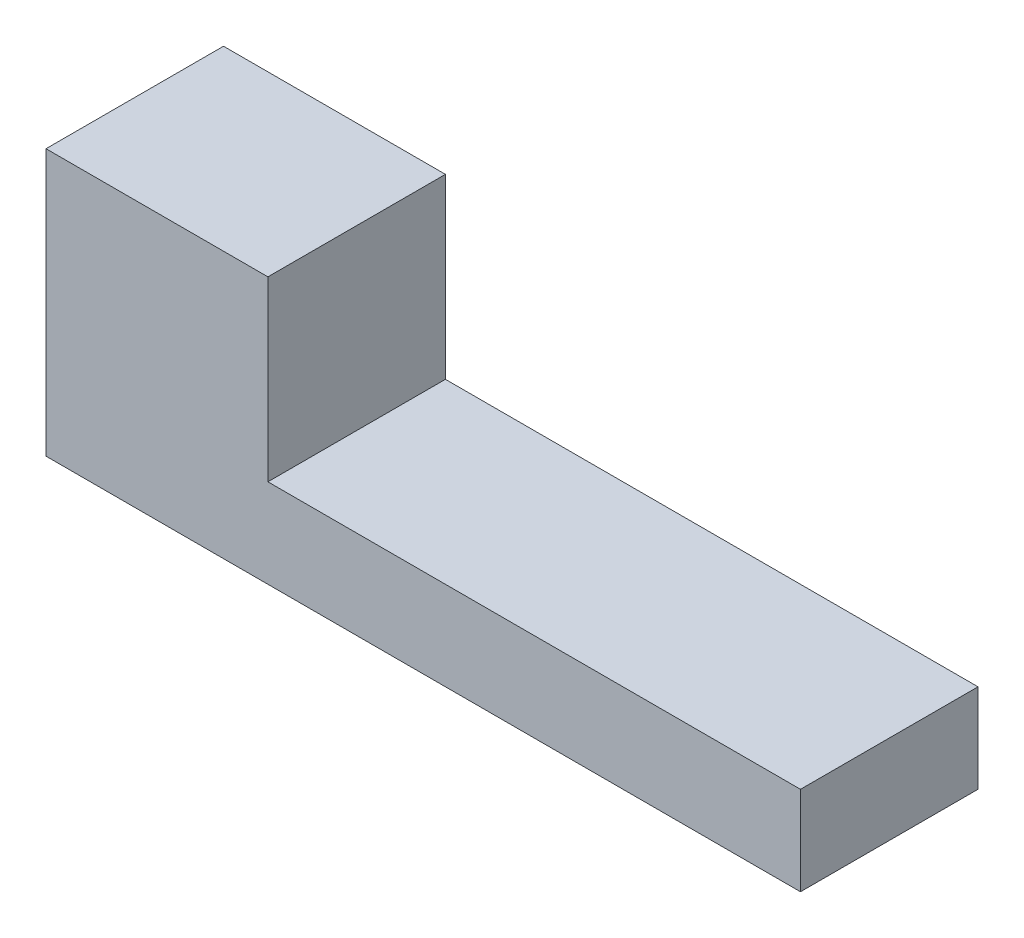
ISO-10303-21;
HEADER;
FILE_DESCRIPTION(('STEP AP214'),'2;1');
FILE_NAME('part.step','',(''),(''),'','','');
FILE_SCHEMA(('AUTOMOTIVE_DESIGN { 1 0 10303 214 1 1 1 1 }'));
ENDSEC;
DATA;
#1=APPLICATION_CONTEXT('core data for automotive mechanical design processes');
#2=APPLICATION_PROTOCOL_DEFINITION('international standard','automotive_design',2000,#1);
#3=PRODUCT_CONTEXT('',#1,'mechanical');
#4=PRODUCT('Part','Part','',(#3));
#5=PRODUCT_RELATED_PRODUCT_CATEGORY('part','',(#4));
#6=PRODUCT_DEFINITION_FORMATION('','',#4);
#7=PRODUCT_DEFINITION_CONTEXT('part definition',#1,'design');
#8=PRODUCT_DEFINITION('design','',#6,#7);
#9=PRODUCT_DEFINITION_SHAPE('','',#8);
#10=(LENGTH_UNIT() NAMED_UNIT(*) SI_UNIT(.MILLI.,.METRE.));
#11=(NAMED_UNIT(*) PLANE_ANGLE_UNIT() SI_UNIT($,.RADIAN.));
#12=(NAMED_UNIT(*) SI_UNIT($,.STERADIAN.) SOLID_ANGLE_UNIT());
#13=UNCERTAINTY_MEASURE_WITH_UNIT(LENGTH_MEASURE(1.E-05),#10,'distance_accuracy_value','');
#14=(GEOMETRIC_REPRESENTATION_CONTEXT(3) GLOBAL_UNCERTAINTY_ASSIGNED_CONTEXT((#13)) GLOBAL_UNIT_ASSIGNED_CONTEXT((#10,
#11,#12)) REPRESENTATION_CONTEXT('',''));
#15=CARTESIAN_POINT('',(0.,0.,0.));
#16=DIRECTION('',(0.,0.,1.));
#17=DIRECTION('',(1.,0.,0.));
#18=AXIS2_PLACEMENT_3D('',#15,#16,#17);
#19=CARTESIAN_POINT('',(0.,100.,0.));
#20=DIRECTION('',(0.,-1.,0.));
#21=DIRECTION('',(0.,0.,-1.));
#22=AXIS2_PLACEMENT_3D('',#19,#20,#21);
#23=PLANE('',#22);
#24=DIRECTION('',(0.,0.,-1.));
#25=VECTOR('',#24,1.);
#26=CARTESIAN_POINT('',(250.,100.,0.));
#27=LINE('',#26,#25);
#28=CARTESIAN_POINT('',(250.,100.,0.));
#29=VERTEX_POINT('',#28);
#30=CARTESIAN_POINT('',(250.,100.,-200.));
#31=VERTEX_POINT('',#30);
#32=EDGE_CURVE('E50',#29,#31,#27,.T.);
#33=ORIENTED_EDGE('',*,*,#32,.F.);
#34=DIRECTION('',(1.,0.,0.));
#35=VECTOR('',#34,1.);
#36=CARTESIAN_POINT('',(0.,100.,0.));
#37=LINE('',#36,#35);
#38=CARTESIAN_POINT('',(850.,100.,0.));
#39=VERTEX_POINT('',#38);
#40=EDGE_CURVE('E87',#29,#39,#37,.T.);
#41=ORIENTED_EDGE('',*,*,#40,.T.);
#42=DIRECTION('',(0.,0.,-1.));
#43=VECTOR('',#42,1.);
#44=CARTESIAN_POINT('',(850.,100.,0.));
#45=LINE('',#44,#43);
#46=CARTESIAN_POINT('',(850.,100.,-200.));
#47=VERTEX_POINT('',#46);
#48=EDGE_CURVE('E56',#39,#47,#45,.T.);
#49=ORIENTED_EDGE('',*,*,#48,.T.);
#50=DIRECTION('',(-1.,0.,0.));
#51=VECTOR('',#50,1.);
#52=CARTESIAN_POINT('',(0.,100.,-200.));
#53=LINE('',#52,#51);
#54=EDGE_CURVE('E97',#47,#31,#53,.T.);
#55=ORIENTED_EDGE('',*,*,#54,.T.);
#56=EDGE_LOOP('',(#33,#41,#49,#55));
#57=FACE_BOUND('',#56,.T.);
#58=ADVANCED_FACE('F35',(#57),#23,.F.);
#59=CARTESIAN_POINT('',(0.,100.,0.));
#60=DIRECTION('',(1.,0.,0.));
#61=DIRECTION('',(0.,0.,-1.));
#62=AXIS2_PLACEMENT_3D('',#59,#60,#61);
#63=PLANE('',#62);
#64=DIRECTION('',(0.,0.,1.));
#65=VECTOR('',#64,1.);
#66=CARTESIAN_POINT('',(0.,0.,0.));
#67=LINE('',#66,#65);
#68=CARTESIAN_POINT('',(0.,0.,-200.));
#69=VERTEX_POINT('',#68);
#70=CARTESIAN_POINT('',(0.,0.,0.));
#71=VERTEX_POINT('',#70);
#72=EDGE_CURVE('E94',#69,#71,#67,.T.);
#73=ORIENTED_EDGE('',*,*,#72,.T.);
#74=DIRECTION('',(0.,-1.,0.));
#75=VECTOR('',#74,1.);
#76=CARTESIAN_POINT('',(0.,100.,0.));
#77=LINE('',#76,#75);
#78=CARTESIAN_POINT('',(0.,300.,0.));
#79=VERTEX_POINT('',#78);
#80=EDGE_CURVE('E11',#79,#71,#77,.T.);
#81=ORIENTED_EDGE('',*,*,#80,.F.);
#82=DIRECTION('',(0.,0.,1.));
#83=VECTOR('',#82,1.);
#84=CARTESIAN_POINT('',(0.,300.,0.));
#85=LINE('',#84,#83);
#86=CARTESIAN_POINT('',(0.,300.,-200.));
#87=VERTEX_POINT('',#86);
#88=EDGE_CURVE('E96',#87,#79,#85,.T.);
#89=ORIENTED_EDGE('',*,*,#88,.F.);
#90=DIRECTION('',(0.,-1.,0.));
#91=VECTOR('',#90,1.);
#92=CARTESIAN_POINT('',(0.,100.,-200.));
#93=LINE('',#92,#91);
#94=EDGE_CURVE('E80',#87,#69,#93,.T.);
#95=ORIENTED_EDGE('',*,*,#94,.T.);
#96=EDGE_LOOP('',(#73,#81,#89,#95));
#97=FACE_BOUND('',#96,.T.);
#98=ADVANCED_FACE('F37',(#97),#63,.F.);
#99=CARTESIAN_POINT('',(0.,100.,0.));
#100=DIRECTION('',(0.,0.,-1.));
#101=DIRECTION('',(-1.,0.,0.));
#102=AXIS2_PLACEMENT_3D('',#99,#100,#101);
#103=PLANE('',#102);
#104=DIRECTION('',(1.,0.,0.));
#105=VECTOR('',#104,1.);
#106=CARTESIAN_POINT('',(0.,0.,0.));
#107=LINE('',#106,#105);
#108=CARTESIAN_POINT('',(850.,0.,0.));
#109=VERTEX_POINT('',#108);
#110=EDGE_CURVE('E100',#71,#109,#107,.T.);
#111=ORIENTED_EDGE('',*,*,#110,.T.);
#112=DIRECTION('',(0.,-1.,0.));
#113=VECTOR('',#112,1.);
#114=CARTESIAN_POINT('',(850.,100.,0.));
#115=LINE('',#114,#113);
#116=EDGE_CURVE('E43',#39,#109,#115,.T.);
#117=ORIENTED_EDGE('',*,*,#116,.F.);
#118=ORIENTED_EDGE('',*,*,#40,.F.);
#119=DIRECTION('',(0.,-1.,0.));
#120=VECTOR('',#119,1.);
#121=CARTESIAN_POINT('',(250.,300.,0.));
#122=LINE('',#121,#120);
#123=CARTESIAN_POINT('',(250.,300.,0.));
#124=VERTEX_POINT('',#123);
#125=EDGE_CURVE('E101',#124,#29,#122,.T.);
#126=ORIENTED_EDGE('',*,*,#125,.F.);
#127=DIRECTION('',(1.,0.,0.));
#128=VECTOR('',#127,1.);
#129=CARTESIAN_POINT('',(0.,300.,0.));
#130=LINE('',#129,#128);
#131=EDGE_CURVE('E121',#79,#124,#130,.T.);
#132=ORIENTED_EDGE('',*,*,#131,.F.);
#133=ORIENTED_EDGE('',*,*,#80,.T.);
#134=EDGE_LOOP('',(#111,#117,#118,#126,#132,#133));
#135=FACE_BOUND('',#134,.T.);
#136=ADVANCED_FACE('F116',(#135),#103,.F.);
#137=CARTESIAN_POINT('',(850.,100.,0.));
#138=DIRECTION('',(-1.,0.,0.));
#139=DIRECTION('',(0.,0.,1.));
#140=AXIS2_PLACEMENT_3D('',#137,#138,#139);
#141=PLANE('',#140);
#142=DIRECTION('',(0.,0.,-1.));
#143=VECTOR('',#142,1.);
#144=CARTESIAN_POINT('',(850.,0.,0.));
#145=LINE('',#144,#143);
#146=CARTESIAN_POINT('',(850.,0.,-200.));
#147=VERTEX_POINT('',#146);
#148=EDGE_CURVE('E88',#109,#147,#145,.T.);
#149=ORIENTED_EDGE('',*,*,#148,.T.);
#150=DIRECTION('',(0.,-1.,0.));
#151=VECTOR('',#150,1.);
#152=CARTESIAN_POINT('',(850.,100.,-200.));
#153=LINE('',#152,#151);
#154=EDGE_CURVE('E83',#47,#147,#153,.T.);
#155=ORIENTED_EDGE('',*,*,#154,.F.);
#156=ORIENTED_EDGE('',*,*,#48,.F.);
#157=ORIENTED_EDGE('',*,*,#116,.T.);
#158=EDGE_LOOP('',(#149,#155,#156,#157));
#159=FACE_BOUND('',#158,.T.);
#160=ADVANCED_FACE('F114',(#159),#141,.F.);
#161=CARTESIAN_POINT('',(0.,100.,-200.));
#162=DIRECTION('',(0.,0.,1.));
#163=DIRECTION('',(1.,0.,0.));
#164=AXIS2_PLACEMENT_3D('',#161,#162,#163);
#165=PLANE('',#164);
#166=DIRECTION('',(-1.,0.,0.));
#167=VECTOR('',#166,1.);
#168=CARTESIAN_POINT('',(0.,0.,-200.));
#169=LINE('',#168,#167);
#170=EDGE_CURVE('E76',#147,#69,#169,.T.);
#171=ORIENTED_EDGE('',*,*,#170,.T.);
#172=ORIENTED_EDGE('',*,*,#94,.F.);
#173=DIRECTION('',(-1.,0.,0.));
#174=VECTOR('',#173,1.);
#175=CARTESIAN_POINT('',(0.,300.,-200.));
#176=LINE('',#175,#174);
#177=CARTESIAN_POINT('',(250.,300.,-200.));
#178=VERTEX_POINT('',#177);
#179=EDGE_CURVE('E135',#178,#87,#176,.T.);
#180=ORIENTED_EDGE('',*,*,#179,.F.);
#181=DIRECTION('',(0.,-1.,0.));
#182=VECTOR('',#181,1.);
#183=CARTESIAN_POINT('',(250.,300.,-200.));
#184=LINE('',#183,#182);
#185=EDGE_CURVE('E105',#178,#31,#184,.T.);
#186=ORIENTED_EDGE('',*,*,#185,.T.);
#187=ORIENTED_EDGE('',*,*,#54,.F.);
#188=ORIENTED_EDGE('',*,*,#154,.T.);
#189=EDGE_LOOP('',(#171,#172,#180,#186,#187,#188));
#190=FACE_BOUND('',#189,.T.);
#191=ADVANCED_FACE('F78',(#190),#165,.F.);
#192=CARTESIAN_POINT('',(0.,0.,0.));
#193=DIRECTION('',(0.,-1.,0.));
#194=DIRECTION('',(0.,0.,-1.));
#195=AXIS2_PLACEMENT_3D('',#192,#193,#194);
#196=PLANE('',#195);
#197=ORIENTED_EDGE('',*,*,#72,.F.);
#198=ORIENTED_EDGE('',*,*,#170,.F.);
#199=ORIENTED_EDGE('',*,*,#148,.F.);
#200=ORIENTED_EDGE('',*,*,#110,.F.);
#201=EDGE_LOOP('',(#197,#198,#199,#200));
#202=FACE_BOUND('',#201,.T.);
#203=ADVANCED_FACE('F99',(#202),#196,.T.);
#204=CARTESIAN_POINT('',(250.,300.,0.));
#205=DIRECTION('',(-1.,0.,0.));
#206=DIRECTION('',(0.,0.,1.));
#207=AXIS2_PLACEMENT_3D('',#204,#205,#206);
#208=PLANE('',#207);
#209=ORIENTED_EDGE('',*,*,#32,.T.);
#210=ORIENTED_EDGE('',*,*,#185,.F.);
#211=DIRECTION('',(0.,0.,-1.));
#212=VECTOR('',#211,1.);
#213=CARTESIAN_POINT('',(250.,300.,0.));
#214=LINE('',#213,#212);
#215=EDGE_CURVE('E132',#124,#178,#214,.T.);
#216=ORIENTED_EDGE('',*,*,#215,.F.);
#217=ORIENTED_EDGE('',*,*,#125,.T.);
#218=EDGE_LOOP('',(#209,#210,#216,#217));
#219=FACE_BOUND('',#218,.T.);
#220=ADVANCED_FACE('F139',(#219),#208,.F.);
#221=CARTESIAN_POINT('',(0.,300.,0.));
#222=DIRECTION('',(0.,-1.,0.));
#223=DIRECTION('',(0.,0.,-1.));
#224=AXIS2_PLACEMENT_3D('',#221,#222,#223);
#225=PLANE('',#224);
#226=ORIENTED_EDGE('',*,*,#88,.T.);
#227=ORIENTED_EDGE('',*,*,#131,.T.);
#228=ORIENTED_EDGE('',*,*,#215,.T.);
#229=ORIENTED_EDGE('',*,*,#179,.T.);
#230=EDGE_LOOP('',(#226,#227,#228,#229));
#231=FACE_BOUND('',#230,.T.);
#232=ADVANCED_FACE('F134',(#231),#225,.F.);
#233=CLOSED_SHELL('',(#58,#98,#136,#160,#191,#203,#220,#232));
#234=MANIFOLD_SOLID_BREP('B2',#233);
#235=ADVANCED_BREP_SHAPE_REPRESENTATION('',(#18,#234),#14);
#236=SHAPE_DEFINITION_REPRESENTATION(#9,#235);
ENDSEC;
END-ISO-10303-21;
